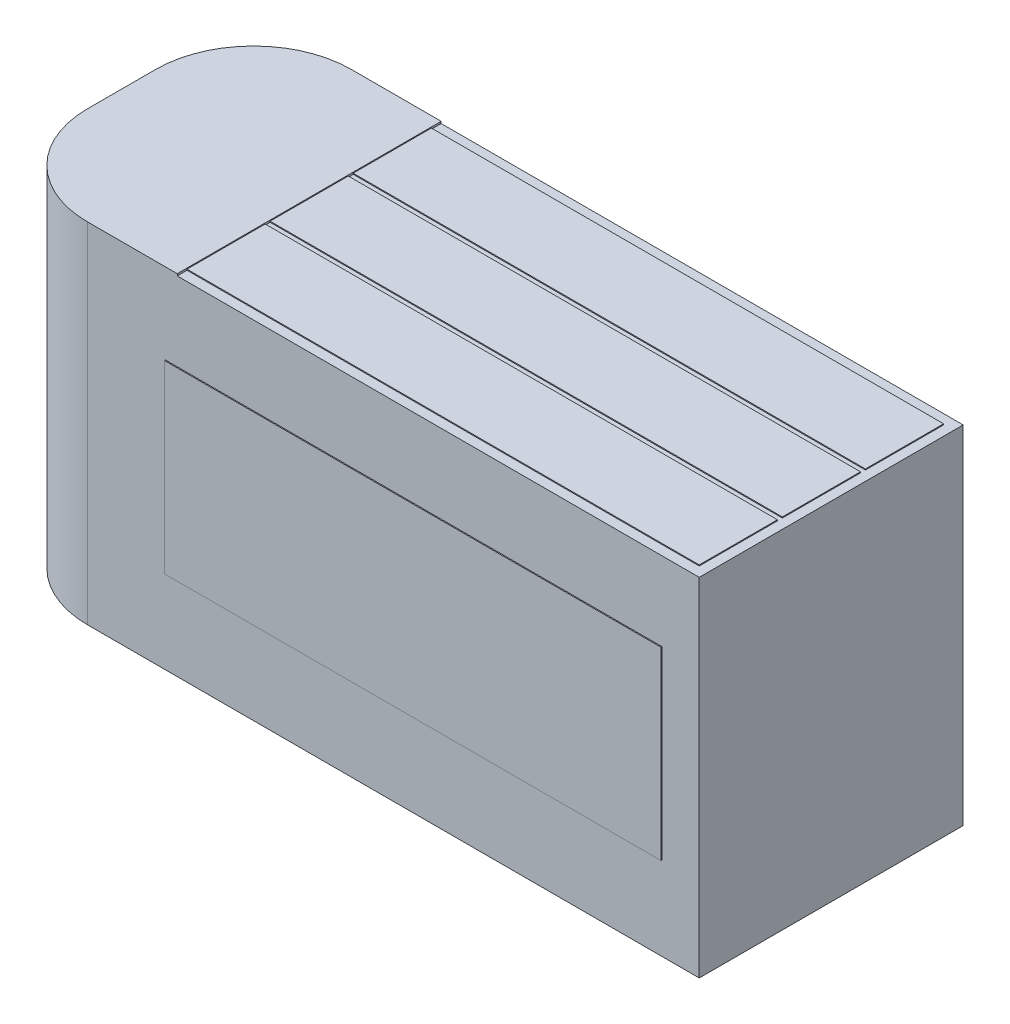
ISO-10303-21;
HEADER;
FILE_DESCRIPTION(('STEP AP214'),'2;1');
FILE_NAME('part.step','',(''),(''),'','','');
FILE_SCHEMA(('AUTOMOTIVE_DESIGN { 1 0 10303 214 1 1 1 1 }'));
ENDSEC;
DATA;
#1=APPLICATION_CONTEXT('core data for automotive mechanical design processes');
#2=APPLICATION_PROTOCOL_DEFINITION('international standard','automotive_design',2000,#1);
#3=PRODUCT_CONTEXT('',#1,'mechanical');
#4=PRODUCT('Part','Part','',(#3));
#5=PRODUCT_RELATED_PRODUCT_CATEGORY('part','',(#4));
#6=PRODUCT_DEFINITION_FORMATION('','',#4);
#7=PRODUCT_DEFINITION_CONTEXT('part definition',#1,'design');
#8=PRODUCT_DEFINITION('design','',#6,#7);
#9=PRODUCT_DEFINITION_SHAPE('','',#8);
#10=(LENGTH_UNIT() NAMED_UNIT(*) SI_UNIT(.MILLI.,.METRE.));
#11=(NAMED_UNIT(*) PLANE_ANGLE_UNIT() SI_UNIT($,.RADIAN.));
#12=(NAMED_UNIT(*) SI_UNIT($,.STERADIAN.) SOLID_ANGLE_UNIT());
#13=UNCERTAINTY_MEASURE_WITH_UNIT(LENGTH_MEASURE(1.E-05),#10,'distance_accuracy_value','');
#14=(GEOMETRIC_REPRESENTATION_CONTEXT(3) GLOBAL_UNCERTAINTY_ASSIGNED_CONTEXT((#13)) GLOBAL_UNIT_ASSIGNED_CONTEXT((#10,
#11,#12)) REPRESENTATION_CONTEXT('',''));
#15=CARTESIAN_POINT('',(0.,0.,0.));
#16=DIRECTION('',(0.,0.,1.));
#17=DIRECTION('',(1.,0.,0.));
#18=AXIS2_PLACEMENT_3D('',#15,#16,#17);
#19=CARTESIAN_POINT('',(0.,0.,0.));
#20=DIRECTION('',(0.,0.,-1.));
#21=DIRECTION('',(-1.,0.,0.));
#22=AXIS2_PLACEMENT_3D('',#19,#20,#21);
#23=PLANE('',#22);
#24=DIRECTION('',(1.,0.,0.));
#25=VECTOR('',#24,1.);
#26=CARTESIAN_POINT('',(-36.3,-17.75,0.));
#27=LINE('',#26,#25);
#28=CARTESIAN_POINT('',(-26.3,-17.75,0.));
#29=VERTEX_POINT('',#28);
#30=CARTESIAN_POINT('',(36.3,-17.75,0.));
#31=VERTEX_POINT('',#30);
#32=EDGE_CURVE('E470',#29,#31,#27,.T.);
#33=ORIENTED_EDGE('',*,*,#32,.F.);
#34=DIRECTION('',(0.,-1.,0.));
#35=VECTOR('',#34,1.);
#36=CARTESIAN_POINT('',(-26.3,17.75,0.));
#37=LINE('',#36,#35);
#38=CARTESIAN_POINT('',(-26.3,17.95,0.));
#39=VERTEX_POINT('',#38);
#40=EDGE_CURVE('E50',#29,#39,#37,.F.);
#41=ORIENTED_EDGE('',*,*,#40,.T.);
#42=DIRECTION('',(-1.,0.,0.));
#43=VECTOR('',#42,1.);
#44=CARTESIAN_POINT('',(-26.3,17.95,0.));
#45=LINE('',#44,#43);
#46=CARTESIAN_POINT('',(-17.1,17.95,0.));
#47=VERTEX_POINT('',#46);
#48=EDGE_CURVE('E269',#47,#39,#45,.T.);
#49=ORIENTED_EDGE('',*,*,#48,.F.);
#50=DIRECTION('',(0.,-1.,0.));
#51=VECTOR('',#50,1.);
#52=CARTESIAN_POINT('',(-17.1,17.95,0.));
#53=LINE('',#52,#51);
#54=CARTESIAN_POINT('',(-17.1,17.75,0.));
#55=VERTEX_POINT('',#54);
#56=EDGE_CURVE('E293',#47,#55,#53,.T.);
#57=ORIENTED_EDGE('',*,*,#56,.T.);
#58=DIRECTION('',(-1.,0.,0.));
#59=VECTOR('',#58,1.);
#60=CARTESIAN_POINT('',(-36.3,17.75,0.));
#61=LINE('',#60,#59);
#62=CARTESIAN_POINT('',(36.3,17.75,0.));
#63=VERTEX_POINT('',#62);
#64=EDGE_CURVE('E481',#63,#55,#61,.T.);
#65=ORIENTED_EDGE('',*,*,#64,.F.);
#66=DIRECTION('',(0.,1.,0.));
#67=VECTOR('',#66,1.);
#68=CARTESIAN_POINT('',(36.3,-17.75,0.));
#69=LINE('',#68,#67);
#70=EDGE_CURVE('E464',#31,#63,#69,.T.);
#71=ORIENTED_EDGE('',*,*,#70,.F.);
#72=EDGE_LOOP('',(#33,#41,#49,#57,#65,#71));
#73=FACE_BOUND('',#72,.T.);
#74=DIRECTION('',(-1.,0.,0.));
#75=VECTOR('',#74,1.);
#76=CARTESIAN_POINT('',(33.2747280856501,-8.4,0.));
#77=LINE('',#76,#75);
#78=CARTESIAN_POINT('',(33.2747280856501,-8.4,0.));
#79=VERTEX_POINT('',#78);
#80=CARTESIAN_POINT('',(-20.2252719143499,-8.4,0.));
#81=VERTEX_POINT('',#80);
#82=EDGE_CURVE('E908',#79,#81,#77,.T.);
#83=ORIENTED_EDGE('',*,*,#82,.F.);
#84=DIRECTION('',(0.,-1.,0.));
#85=VECTOR('',#84,1.);
#86=CARTESIAN_POINT('',(33.2747280856501,11.3,0.));
#87=LINE('',#86,#85);
#88=CARTESIAN_POINT('',(33.2747280856501,11.3,0.));
#89=VERTEX_POINT('',#88);
#90=EDGE_CURVE('E252',#89,#79,#87,.T.);
#91=ORIENTED_EDGE('',*,*,#90,.F.);
#92=DIRECTION('',(1.,0.,0.));
#93=VECTOR('',#92,1.);
#94=CARTESIAN_POINT('',(33.2747280856501,11.3,0.));
#95=LINE('',#94,#93);
#96=CARTESIAN_POINT('',(-20.2252719143499,11.3,0.));
#97=VERTEX_POINT('',#96);
#98=EDGE_CURVE('E248',#97,#89,#95,.T.);
#99=ORIENTED_EDGE('',*,*,#98,.F.);
#100=DIRECTION('',(0.,1.,0.));
#101=VECTOR('',#100,1.);
#102=CARTESIAN_POINT('',(-20.2252719143499,11.3,0.));
#103=LINE('',#102,#101);
#104=EDGE_CURVE('E904',#81,#97,#103,.T.);
#105=ORIENTED_EDGE('',*,*,#104,.F.);
#106=EDGE_LOOP('',(#83,#91,#99,#105));
#107=FACE_BOUND('',#106,.T.);
#108=ADVANCED_FACE('F41',(#73,#107),#23,.T.);
#109=CARTESIAN_POINT('',(-36.3,17.75,27.));
#110=DIRECTION('',(0.,-1.,0.));
#111=DIRECTION('',(0.,0.,-1.));
#112=AXIS2_PLACEMENT_3D('',#109,#110,#111);
#113=PLANE('',#112);
#114=DIRECTION('',(0.,0.,-1.));
#115=VECTOR('',#114,1.);
#116=CARTESIAN_POINT('',(-17.1,17.75,0.));
#117=LINE('',#116,#115);
#118=CARTESIAN_POINT('',(-17.1,17.75,27.));
#119=VERTEX_POINT('',#118);
#120=CARTESIAN_POINT('',(-17.1,17.75,26.));
#121=VERTEX_POINT('',#120);
#122=EDGE_CURVE('E261',#119,#121,#117,.T.);
#123=ORIENTED_EDGE('',*,*,#122,.F.);
#124=DIRECTION('',(-1.,0.,0.));
#125=VECTOR('',#124,1.);
#126=CARTESIAN_POINT('',(-36.3,17.75,27.));
#127=LINE('',#126,#125);
#128=CARTESIAN_POINT('',(36.3,17.75,27.));
#129=VERTEX_POINT('',#128);
#130=EDGE_CURVE('E469',#129,#119,#127,.T.);
#131=ORIENTED_EDGE('',*,*,#130,.F.);
#132=DIRECTION('',(0.,0.,-1.));
#133=VECTOR('',#132,1.);
#134=CARTESIAN_POINT('',(36.3,17.75,27.));
#135=LINE('',#134,#133);
#136=EDGE_CURVE('E494',#129,#63,#135,.T.);
#137=ORIENTED_EDGE('',*,*,#136,.T.);
#138=ORIENTED_EDGE('',*,*,#64,.T.);
#139=CARTESIAN_POINT('',(-17.1,17.75,0.999999999999997));
#140=VERTEX_POINT('',#139);
#141=EDGE_CURVE('E255',#140,#55,#117,.T.);
#142=ORIENTED_EDGE('',*,*,#141,.F.);
#143=DIRECTION('',(-1.,0.,0.));
#144=VECTOR('',#143,1.);
#145=CARTESIAN_POINT('',(35.3,17.75,0.999999999999997));
#146=LINE('',#145,#144);
#147=CARTESIAN_POINT('',(35.3,17.75,0.999999999999997));
#148=VERTEX_POINT('',#147);
#149=EDGE_CURVE('E443',#148,#140,#146,.T.);
#150=ORIENTED_EDGE('',*,*,#149,.F.);
#151=DIRECTION('',(0.,0.,-1.));
#152=VECTOR('',#151,1.);
#153=CARTESIAN_POINT('',(35.3,17.75,0.999999999999997));
#154=LINE('',#153,#152);
#155=CARTESIAN_POINT('',(35.3,17.75,9.));
#156=VERTEX_POINT('',#155);
#157=EDGE_CURVE('E422',#156,#148,#154,.T.);
#158=ORIENTED_EDGE('',*,*,#157,.F.);
#159=DIRECTION('',(1.,0.,0.));
#160=VECTOR('',#159,1.);
#161=CARTESIAN_POINT('',(35.3,17.75,9.));
#162=LINE('',#161,#160);
#163=CARTESIAN_POINT('',(-17.1,17.75,9.00000000000001));
#164=VERTEX_POINT('',#163);
#165=EDGE_CURVE('E428',#164,#156,#162,.T.);
#166=ORIENTED_EDGE('',*,*,#165,.F.);
#167=CARTESIAN_POINT('',(-17.1,17.75,9.5));
#168=VERTEX_POINT('',#167);
#169=EDGE_CURVE('E259',#168,#164,#117,.T.);
#170=ORIENTED_EDGE('',*,*,#169,.F.);
#171=DIRECTION('',(-1.,0.,0.));
#172=VECTOR('',#171,1.);
#173=CARTESIAN_POINT('',(35.3,17.75,9.5));
#174=LINE('',#173,#172);
#175=CARTESIAN_POINT('',(35.3,17.75,9.5));
#176=VERTEX_POINT('',#175);
#177=EDGE_CURVE('E401',#176,#168,#174,.T.);
#178=ORIENTED_EDGE('',*,*,#177,.F.);
#179=DIRECTION('',(0.,0.,-1.));
#180=VECTOR('',#179,1.);
#181=CARTESIAN_POINT('',(35.3,17.75,9.5));
#182=LINE('',#181,#180);
#183=CARTESIAN_POINT('',(35.3,17.75,17.5));
#184=VERTEX_POINT('',#183);
#185=EDGE_CURVE('E380',#184,#176,#182,.T.);
#186=ORIENTED_EDGE('',*,*,#185,.F.);
#187=DIRECTION('',(1.,0.,0.));
#188=VECTOR('',#187,1.);
#189=CARTESIAN_POINT('',(35.3,17.75,17.5));
#190=LINE('',#189,#188);
#191=CARTESIAN_POINT('',(-17.1,17.75,17.5));
#192=VERTEX_POINT('',#191);
#193=EDGE_CURVE('E386',#192,#184,#190,.T.);
#194=ORIENTED_EDGE('',*,*,#193,.F.);
#195=CARTESIAN_POINT('',(-17.1,17.75,18.));
#196=VERTEX_POINT('',#195);
#197=EDGE_CURVE('E290',#196,#192,#117,.T.);
#198=ORIENTED_EDGE('',*,*,#197,.F.);
#199=DIRECTION('',(-1.,0.,0.));
#200=VECTOR('',#199,1.);
#201=CARTESIAN_POINT('',(-17.1,17.75,18.));
#202=LINE('',#201,#200);
#203=CARTESIAN_POINT('',(35.3,17.75,18.));
#204=VERTEX_POINT('',#203);
#205=EDGE_CURVE('E345',#204,#196,#202,.T.);
#206=ORIENTED_EDGE('',*,*,#205,.F.);
#207=DIRECTION('',(0.,0.,-1.));
#208=VECTOR('',#207,1.);
#209=CARTESIAN_POINT('',(35.3,17.75,18.));
#210=LINE('',#209,#208);
#211=CARTESIAN_POINT('',(35.3,17.75,26.));
#212=VERTEX_POINT('',#211);
#213=EDGE_CURVE('E359',#212,#204,#210,.T.);
#214=ORIENTED_EDGE('',*,*,#213,.F.);
#215=DIRECTION('',(1.,0.,0.));
#216=VECTOR('',#215,1.);
#217=CARTESIAN_POINT('',(-17.1,17.75,26.));
#218=LINE('',#217,#216);
#219=EDGE_CURVE('E339',#121,#212,#218,.T.);
#220=ORIENTED_EDGE('',*,*,#219,.F.);
#221=EDGE_LOOP('',(#123,#131,#137,#138,#142,#150,#158,#166,#170,#178,#186,#194,#198,#206,#214,#220));
#222=FACE_BOUND('',#221,.T.);
#223=ADVANCED_FACE('F543',(#222),#113,.F.);
#224=CARTESIAN_POINT('',(0.,0.,27.));
#225=DIRECTION('',(0.,0.,-1.));
#226=DIRECTION('',(-1.,0.,0.));
#227=AXIS2_PLACEMENT_3D('',#224,#225,#226);
#228=PLANE('',#227);
#229=ORIENTED_EDGE('',*,*,#130,.T.);
#230=DIRECTION('',(0.,-1.,0.));
#231=VECTOR('',#230,1.);
#232=CARTESIAN_POINT('',(-17.1,17.95,27.));
#233=LINE('',#232,#231);
#234=CARTESIAN_POINT('',(-17.1,17.95,27.));
#235=VERTEX_POINT('',#234);
#236=EDGE_CURVE('E287',#235,#119,#233,.T.);
#237=ORIENTED_EDGE('',*,*,#236,.F.);
#238=DIRECTION('',(1.,0.,0.));
#239=VECTOR('',#238,1.);
#240=CARTESIAN_POINT('',(-17.1,17.95,27.));
#241=LINE('',#240,#239);
#242=CARTESIAN_POINT('',(-26.3,17.95,27.));
#243=VERTEX_POINT('',#242);
#244=EDGE_CURVE('E285',#243,#235,#241,.T.);
#245=ORIENTED_EDGE('',*,*,#244,.F.);
#246=DIRECTION('',(0.,-1.,0.));
#247=VECTOR('',#246,1.);
#248=CARTESIAN_POINT('',(-26.3,0.,27.));
#249=LINE('',#248,#247);
#250=CARTESIAN_POINT('',(-26.3,-17.75,27.));
#251=VERTEX_POINT('',#250);
#252=EDGE_CURVE('E11',#243,#251,#249,.T.);
#253=ORIENTED_EDGE('',*,*,#252,.T.);
#254=DIRECTION('',(1.,0.,0.));
#255=VECTOR('',#254,1.);
#256=CARTESIAN_POINT('',(-36.3,-17.75,27.));
#257=LINE('',#256,#255);
#258=CARTESIAN_POINT('',(36.3,-17.75,27.));
#259=VERTEX_POINT('',#258);
#260=EDGE_CURVE('E474',#251,#259,#257,.T.);
#261=ORIENTED_EDGE('',*,*,#260,.T.);
#262=DIRECTION('',(0.,1.,0.));
#263=VECTOR('',#262,1.);
#264=CARTESIAN_POINT('',(36.3,-17.75,27.));
#265=LINE('',#264,#263);
#266=EDGE_CURVE('E465',#259,#129,#265,.T.);
#267=ORIENTED_EDGE('',*,*,#266,.T.);
#268=EDGE_LOOP('',(#229,#237,#245,#253,#261,#267));
#269=FACE_BOUND('',#268,.T.);
#270=DIRECTION('',(0.,-1.,0.));
#271=VECTOR('',#270,1.);
#272=CARTESIAN_POINT('',(-18.3,9.7,27.));
#273=LINE('',#272,#271);
#274=CARTESIAN_POINT('',(-18.3,9.7,27.));
#275=VERTEX_POINT('',#274);
#276=CARTESIAN_POINT('',(-18.3,-9.2,27.));
#277=VERTEX_POINT('',#276);
#278=EDGE_CURVE('E297',#275,#277,#273,.T.);
#279=ORIENTED_EDGE('',*,*,#278,.F.);
#280=DIRECTION('',(-1.,0.,0.));
#281=VECTOR('',#280,1.);
#282=CARTESIAN_POINT('',(-18.3,9.7,27.));
#283=LINE('',#282,#281);
#284=CARTESIAN_POINT('',(32.5,9.7,27.));
#285=VERTEX_POINT('',#284);
#286=EDGE_CURVE('E303',#285,#275,#283,.T.);
#287=ORIENTED_EDGE('',*,*,#286,.F.);
#288=DIRECTION('',(0.,1.,0.));
#289=VECTOR('',#288,1.);
#290=CARTESIAN_POINT('',(32.5,9.7,27.));
#291=LINE('',#290,#289);
#292=CARTESIAN_POINT('',(32.5,-9.2,27.));
#293=VERTEX_POINT('',#292);
#294=EDGE_CURVE('E318',#293,#285,#291,.T.);
#295=ORIENTED_EDGE('',*,*,#294,.F.);
#296=DIRECTION('',(1.,0.,0.));
#297=VECTOR('',#296,1.);
#298=CARTESIAN_POINT('',(-18.3,-9.2,27.));
#299=LINE('',#298,#297);
#300=EDGE_CURVE('E65',#277,#293,#299,.T.);
#301=ORIENTED_EDGE('',*,*,#300,.F.);
#302=EDGE_LOOP('',(#279,#287,#295,#301));
#303=FACE_BOUND('',#302,.T.);
#304=ADVANCED_FACE('F536',(#269,#303),#228,.F.);
#305=CARTESIAN_POINT('',(36.3,-17.75,27.));
#306=DIRECTION('',(-1.,0.,0.));
#307=DIRECTION('',(0.,0.,1.));
#308=AXIS2_PLACEMENT_3D('',#305,#306,#307);
#309=PLANE('',#308);
#310=ORIENTED_EDGE('',*,*,#70,.T.);
#311=ORIENTED_EDGE('',*,*,#136,.F.);
#312=ORIENTED_EDGE('',*,*,#266,.F.);
#313=DIRECTION('',(0.,0.,-1.));
#314=VECTOR('',#313,1.);
#315=CARTESIAN_POINT('',(36.3,-17.75,27.));
#316=LINE('',#315,#314);
#317=EDGE_CURVE('E477',#259,#31,#316,.T.);
#318=ORIENTED_EDGE('',*,*,#317,.T.);
#319=EDGE_LOOP('',(#310,#311,#312,#318));
#320=FACE_BOUND('',#319,.T.);
#321=ADVANCED_FACE('F547',(#320),#309,.F.);
#322=CARTESIAN_POINT('',(-36.3,-17.75,27.));
#323=DIRECTION('',(1.,0.,0.));
#324=DIRECTION('',(0.,0.,-1.));
#325=AXIS2_PLACEMENT_3D('',#322,#323,#324);
#326=PLANE('',#325);
#327=DIRECTION('',(0.,-1.,0.));
#328=VECTOR('',#327,1.);
#329=CARTESIAN_POINT('',(-36.3,-17.75,17.));
#330=LINE('',#329,#328);
#331=CARTESIAN_POINT('',(-36.3,-17.75,17.));
#332=VERTEX_POINT('',#331);
#333=CARTESIAN_POINT('',(-36.3,17.95,17.));
#334=VERTEX_POINT('',#333);
#335=EDGE_CURVE('E498',#332,#334,#330,.F.);
#336=ORIENTED_EDGE('',*,*,#335,.T.);
#337=DIRECTION('',(0.,0.,1.));
#338=VECTOR('',#337,1.);
#339=CARTESIAN_POINT('',(-36.3,17.95,10.));
#340=LINE('',#339,#338);
#341=CARTESIAN_POINT('',(-36.3,17.95,9.99999999999999));
#342=VERTEX_POINT('',#341);
#343=EDGE_CURVE('E277',#342,#334,#340,.T.);
#344=ORIENTED_EDGE('',*,*,#343,.F.);
#345=DIRECTION('',(0.,-1.,0.));
#346=VECTOR('',#345,1.);
#347=CARTESIAN_POINT('',(-36.3,-17.75,10.));
#348=LINE('',#347,#346);
#349=CARTESIAN_POINT('',(-36.3,-17.75,10.));
#350=VERTEX_POINT('',#349);
#351=EDGE_CURVE('E501',#342,#350,#348,.T.);
#352=ORIENTED_EDGE('',*,*,#351,.T.);
#353=DIRECTION('',(0.,0.,-1.));
#354=VECTOR('',#353,1.);
#355=CARTESIAN_POINT('',(-36.3,-17.75,27.));
#356=LINE('',#355,#354);
#357=EDGE_CURVE('E490',#332,#350,#356,.T.);
#358=ORIENTED_EDGE('',*,*,#357,.F.);
#359=EDGE_LOOP('',(#336,#344,#352,#358));
#360=FACE_BOUND('',#359,.T.);
#361=ADVANCED_FACE('F526',(#360),#326,.F.);
#362=CARTESIAN_POINT('',(-36.3,-17.75,27.));
#363=DIRECTION('',(0.,1.,0.));
#364=DIRECTION('',(0.,0.,1.));
#365=AXIS2_PLACEMENT_3D('',#362,#363,#364);
#366=PLANE('',#365);
#367=ORIENTED_EDGE('',*,*,#357,.T.);
#368=CARTESIAN_POINT('',(-26.3,-17.75,10.));
#369=DIRECTION('',(0.,1.,0.));
#370=DIRECTION('',(0.,0.,1.));
#371=AXIS2_PLACEMENT_3D('',#368,#369,#370);
#372=CIRCLE('',#371,10.);
#373=EDGE_CURVE('E508',#350,#29,#372,.F.);
#374=ORIENTED_EDGE('',*,*,#373,.T.);
#375=ORIENTED_EDGE('',*,*,#32,.T.);
#376=ORIENTED_EDGE('',*,*,#317,.F.);
#377=ORIENTED_EDGE('',*,*,#260,.F.);
#378=CARTESIAN_POINT('',(-26.3,-17.75,17.));
#379=DIRECTION('',(0.,1.,0.));
#380=DIRECTION('',(0.,0.,1.));
#381=AXIS2_PLACEMENT_3D('',#378,#379,#380);
#382=CIRCLE('',#381,10.);
#383=EDGE_CURVE('E505',#251,#332,#382,.F.);
#384=ORIENTED_EDGE('',*,*,#383,.T.);
#385=EDGE_LOOP('',(#367,#374,#375,#376,#377,#384));
#386=FACE_BOUND('',#385,.T.);
#387=ADVANCED_FACE('F529',(#386),#366,.F.);
#388=CARTESIAN_POINT('',(-26.3,-17.75,10.));
#389=DIRECTION('',(0.,1.,0.));
#390=DIRECTION('',(0.,0.,1.));
#391=AXIS2_PLACEMENT_3D('',#388,#389,#390);
#392=CYLINDRICAL_SURFACE('',#391,10.);
#393=ORIENTED_EDGE('',*,*,#351,.F.);
#394=CARTESIAN_POINT('',(-26.3,17.95,10.));
#395=DIRECTION('',(0.,1.,0.));
#396=DIRECTION('',(0.,0.,1.));
#397=AXIS2_PLACEMENT_3D('',#394,#395,#396);
#398=CIRCLE('',#397,10.);
#399=EDGE_CURVE('E273',#39,#342,#398,.T.);
#400=ORIENTED_EDGE('',*,*,#399,.F.);
#401=ORIENTED_EDGE('',*,*,#40,.F.);
#402=ORIENTED_EDGE('',*,*,#373,.F.);
#403=EDGE_LOOP('',(#393,#400,#401,#402));
#404=FACE_BOUND('',#403,.T.);
#405=ADVANCED_FACE('F523',(#404),#392,.T.);
#406=CARTESIAN_POINT('',(-26.3,0.,17.));
#407=DIRECTION('',(0.,-1.,0.));
#408=DIRECTION('',(0.,0.,-1.));
#409=AXIS2_PLACEMENT_3D('',#406,#407,#408);
#410=CYLINDRICAL_SURFACE('',#409,10.);
#411=ORIENTED_EDGE('',*,*,#252,.F.);
#412=CARTESIAN_POINT('',(-26.2999999999999,17.95,16.9999999999999));
#413=DIRECTION('',(0.,1.,0.));
#414=DIRECTION('',(0.,0.,-1.));
#415=AXIS2_PLACEMENT_3D('',#412,#413,#414);
#416=CIRCLE('',#415,10.0000000000001);
#417=EDGE_CURVE('E281',#334,#243,#416,.T.);
#418=ORIENTED_EDGE('',*,*,#417,.F.);
#419=ORIENTED_EDGE('',*,*,#335,.F.);
#420=ORIENTED_EDGE('',*,*,#383,.F.);
#421=EDGE_LOOP('',(#411,#418,#419,#420));
#422=FACE_BOUND('',#421,.T.);
#423=ADVANCED_FACE('F43',(#422),#410,.T.);
#424=CARTESIAN_POINT('',(35.3,17.85,0.999999999999997));
#425=DIRECTION('',(-1.,0.,0.));
#426=DIRECTION('',(0.,0.,1.));
#427=AXIS2_PLACEMENT_3D('',#424,#425,#426);
#428=PLANE('',#427);
#429=ORIENTED_EDGE('',*,*,#157,.T.);
#430=DIRECTION('',(0.,-1.,0.));
#431=VECTOR('',#430,1.);
#432=CARTESIAN_POINT('',(35.3,17.85,0.999999999999997));
#433=LINE('',#432,#431);
#434=CARTESIAN_POINT('',(35.3,17.85,0.999999999999997));
#435=VERTEX_POINT('',#434);
#436=EDGE_CURVE('E460',#435,#148,#433,.T.);
#437=ORIENTED_EDGE('',*,*,#436,.F.);
#438=DIRECTION('',(0.,0.,-1.));
#439=VECTOR('',#438,1.);
#440=CARTESIAN_POINT('',(35.3,17.85,0.999999999999997));
#441=LINE('',#440,#439);
#442=CARTESIAN_POINT('',(35.3,17.85,9.));
#443=VERTEX_POINT('',#442);
#444=EDGE_CURVE('E423',#443,#435,#441,.T.);
#445=ORIENTED_EDGE('',*,*,#444,.F.);
#446=DIRECTION('',(0.,-1.,0.));
#447=VECTOR('',#446,1.);
#448=CARTESIAN_POINT('',(35.3,17.85,9.));
#449=LINE('',#448,#447);
#450=EDGE_CURVE('E439',#443,#156,#449,.T.);
#451=ORIENTED_EDGE('',*,*,#450,.T.);
#452=EDGE_LOOP('',(#429,#437,#445,#451));
#453=FACE_BOUND('',#452,.T.);
#454=ADVANCED_FACE('F572',(#453),#428,.F.);
#455=CARTESIAN_POINT('',(35.3,17.85,0.999999999999997));
#456=DIRECTION('',(0.,0.,1.));
#457=DIRECTION('',(1.,0.,0.));
#458=AXIS2_PLACEMENT_3D('',#455,#456,#457);
#459=PLANE('',#458);
#460=ORIENTED_EDGE('',*,*,#149,.T.);
#461=DIRECTION('',(0.,-1.,0.));
#462=VECTOR('',#461,1.);
#463=CARTESIAN_POINT('',(-17.1,17.85,0.999999999999997));
#464=LINE('',#463,#462);
#465=CARTESIAN_POINT('',(-17.1,17.85,0.999999999999997));
#466=VERTEX_POINT('',#465);
#467=EDGE_CURVE('E457',#466,#140,#464,.T.);
#468=ORIENTED_EDGE('',*,*,#467,.F.);
#469=DIRECTION('',(-1.,0.,0.));
#470=VECTOR('',#469,1.);
#471=CARTESIAN_POINT('',(35.3,17.85,0.999999999999997));
#472=LINE('',#471,#470);
#473=EDGE_CURVE('E427',#435,#466,#472,.T.);
#474=ORIENTED_EDGE('',*,*,#473,.F.);
#475=ORIENTED_EDGE('',*,*,#436,.T.);
#476=EDGE_LOOP('',(#460,#468,#474,#475));
#477=FACE_BOUND('',#476,.T.);
#478=ADVANCED_FACE('F576',(#477),#459,.F.);
#479=CARTESIAN_POINT('',(35.3,17.85,9.));
#480=DIRECTION('',(0.,0.,-1.));
#481=DIRECTION('',(-1.,0.,0.));
#482=AXIS2_PLACEMENT_3D('',#479,#480,#481);
#483=PLANE('',#482);
#484=ORIENTED_EDGE('',*,*,#165,.T.);
#485=ORIENTED_EDGE('',*,*,#450,.F.);
#486=DIRECTION('',(1.,0.,0.));
#487=VECTOR('',#486,1.);
#488=CARTESIAN_POINT('',(35.3,17.85,9.));
#489=LINE('',#488,#487);
#490=CARTESIAN_POINT('',(-17.1,17.85,9.00000000000001));
#491=VERTEX_POINT('',#490);
#492=EDGE_CURVE('E436',#491,#443,#489,.T.);
#493=ORIENTED_EDGE('',*,*,#492,.F.);
#494=DIRECTION('',(0.,-1.,0.));
#495=VECTOR('',#494,1.);
#496=CARTESIAN_POINT('',(-17.1,17.85,9.00000000000001));
#497=LINE('',#496,#495);
#498=EDGE_CURVE('E453',#491,#164,#497,.T.);
#499=ORIENTED_EDGE('',*,*,#498,.T.);
#500=EDGE_LOOP('',(#484,#485,#493,#499));
#501=FACE_BOUND('',#500,.T.);
#502=ADVANCED_FACE('F581',(#501),#483,.F.);
#503=CARTESIAN_POINT('',(0.,17.85,0.));
#504=DIRECTION('',(0.,-1.,0.));
#505=DIRECTION('',(0.,0.,-1.));
#506=AXIS2_PLACEMENT_3D('',#503,#504,#505);
#507=PLANE('',#506);
#508=ORIENTED_EDGE('',*,*,#444,.T.);
#509=ORIENTED_EDGE('',*,*,#473,.T.);
#510=DIRECTION('',(0.,0.,1.));
#511=VECTOR('',#510,1.);
#512=CARTESIAN_POINT('',(-17.1,17.85,0.999999999999997));
#513=LINE('',#512,#511);
#514=EDGE_CURVE('E432',#466,#491,#513,.T.);
#515=ORIENTED_EDGE('',*,*,#514,.T.);
#516=ORIENTED_EDGE('',*,*,#492,.T.);
#517=EDGE_LOOP('',(#508,#509,#515,#516));
#518=FACE_BOUND('',#517,.T.);
#519=ADVANCED_FACE('F587',(#518),#507,.F.);
#520=CARTESIAN_POINT('',(35.3,17.85,9.5));
#521=DIRECTION('',(-1.,0.,0.));
#522=DIRECTION('',(0.,0.,1.));
#523=AXIS2_PLACEMENT_3D('',#520,#521,#522);
#524=PLANE('',#523);
#525=ORIENTED_EDGE('',*,*,#185,.T.);
#526=DIRECTION('',(0.,-1.,0.));
#527=VECTOR('',#526,1.);
#528=CARTESIAN_POINT('',(35.3,17.85,9.5));
#529=LINE('',#528,#527);
#530=CARTESIAN_POINT('',(35.3,17.85,9.5));
#531=VERTEX_POINT('',#530);
#532=EDGE_CURVE('E418',#531,#176,#529,.T.);
#533=ORIENTED_EDGE('',*,*,#532,.F.);
#534=DIRECTION('',(0.,0.,-1.));
#535=VECTOR('',#534,1.);
#536=CARTESIAN_POINT('',(35.3,17.85,9.5));
#537=LINE('',#536,#535);
#538=CARTESIAN_POINT('',(35.3,17.85,17.5));
#539=VERTEX_POINT('',#538);
#540=EDGE_CURVE('E381',#539,#531,#537,.T.);
#541=ORIENTED_EDGE('',*,*,#540,.F.);
#542=DIRECTION('',(0.,-1.,0.));
#543=VECTOR('',#542,1.);
#544=CARTESIAN_POINT('',(35.3,17.85,17.5));
#545=LINE('',#544,#543);
#546=EDGE_CURVE('E397',#539,#184,#545,.T.);
#547=ORIENTED_EDGE('',*,*,#546,.T.);
#548=EDGE_LOOP('',(#525,#533,#541,#547));
#549=FACE_BOUND('',#548,.T.);
#550=ADVANCED_FACE('F591',(#549),#524,.F.);
#551=CARTESIAN_POINT('',(35.3,17.85,9.5));
#552=DIRECTION('',(0.,0.,1.));
#553=DIRECTION('',(1.,0.,0.));
#554=AXIS2_PLACEMENT_3D('',#551,#552,#553);
#555=PLANE('',#554);
#556=ORIENTED_EDGE('',*,*,#177,.T.);
#557=DIRECTION('',(0.,-1.,0.));
#558=VECTOR('',#557,1.);
#559=CARTESIAN_POINT('',(-17.1,17.85,9.5));
#560=LINE('',#559,#558);
#561=CARTESIAN_POINT('',(-17.1,17.85,9.5));
#562=VERTEX_POINT('',#561);
#563=EDGE_CURVE('E415',#562,#168,#560,.T.);
#564=ORIENTED_EDGE('',*,*,#563,.F.);
#565=DIRECTION('',(-1.,0.,0.));
#566=VECTOR('',#565,1.);
#567=CARTESIAN_POINT('',(35.3,17.85,9.5));
#568=LINE('',#567,#566);
#569=EDGE_CURVE('E385',#531,#562,#568,.T.);
#570=ORIENTED_EDGE('',*,*,#569,.F.);
#571=ORIENTED_EDGE('',*,*,#532,.T.);
#572=EDGE_LOOP('',(#556,#564,#570,#571));
#573=FACE_BOUND('',#572,.T.);
#574=ADVANCED_FACE('F595',(#573),#555,.F.);
#575=CARTESIAN_POINT('',(35.3,17.85,17.5));
#576=DIRECTION('',(0.,0.,-1.));
#577=DIRECTION('',(-1.,0.,0.));
#578=AXIS2_PLACEMENT_3D('',#575,#576,#577);
#579=PLANE('',#578);
#580=ORIENTED_EDGE('',*,*,#193,.T.);
#581=ORIENTED_EDGE('',*,*,#546,.F.);
#582=DIRECTION('',(1.,0.,0.));
#583=VECTOR('',#582,1.);
#584=CARTESIAN_POINT('',(35.3,17.85,17.5));
#585=LINE('',#584,#583);
#586=CARTESIAN_POINT('',(-17.1,17.85,17.5));
#587=VERTEX_POINT('',#586);
#588=EDGE_CURVE('E394',#587,#539,#585,.T.);
#589=ORIENTED_EDGE('',*,*,#588,.F.);
#590=DIRECTION('',(0.,-1.,0.));
#591=VECTOR('',#590,1.);
#592=CARTESIAN_POINT('',(-17.1,17.85,17.5));
#593=LINE('',#592,#591);
#594=EDGE_CURVE('E411',#587,#192,#593,.T.);
#595=ORIENTED_EDGE('',*,*,#594,.T.);
#596=EDGE_LOOP('',(#580,#581,#589,#595));
#597=FACE_BOUND('',#596,.T.);
#598=ADVANCED_FACE('F599',(#597),#579,.F.);
#599=CARTESIAN_POINT('',(0.,17.85,0.));
#600=DIRECTION('',(0.,-1.,0.));
#601=DIRECTION('',(0.,0.,-1.));
#602=AXIS2_PLACEMENT_3D('',#599,#600,#601);
#603=PLANE('',#602);
#604=ORIENTED_EDGE('',*,*,#540,.T.);
#605=ORIENTED_EDGE('',*,*,#569,.T.);
#606=DIRECTION('',(0.,0.,1.));
#607=VECTOR('',#606,1.);
#608=CARTESIAN_POINT('',(-17.1,17.85,9.5));
#609=LINE('',#608,#607);
#610=EDGE_CURVE('E390',#562,#587,#609,.T.);
#611=ORIENTED_EDGE('',*,*,#610,.T.);
#612=ORIENTED_EDGE('',*,*,#588,.T.);
#613=EDGE_LOOP('',(#604,#605,#611,#612));
#614=FACE_BOUND('',#613,.T.);
#615=ADVANCED_FACE('F603',(#614),#603,.F.);
#616=CARTESIAN_POINT('',(-17.1,17.85,26.));
#617=DIRECTION('',(0.,0.,-1.));
#618=DIRECTION('',(-1.,0.,0.));
#619=AXIS2_PLACEMENT_3D('',#616,#617,#618);
#620=PLANE('',#619);
#621=ORIENTED_EDGE('',*,*,#219,.T.);
#622=DIRECTION('',(0.,-1.,0.));
#623=VECTOR('',#622,1.);
#624=CARTESIAN_POINT('',(35.3,17.85,26.));
#625=LINE('',#624,#623);
#626=CARTESIAN_POINT('',(35.3,17.85,26.));
#627=VERTEX_POINT('',#626);
#628=EDGE_CURVE('E372',#627,#212,#625,.T.);
#629=ORIENTED_EDGE('',*,*,#628,.F.);
#630=DIRECTION('',(1.,0.,0.));
#631=VECTOR('',#630,1.);
#632=CARTESIAN_POINT('',(-17.1,17.85,26.));
#633=LINE('',#632,#631);
#634=CARTESIAN_POINT('',(-17.1,17.85,26.));
#635=VERTEX_POINT('',#634);
#636=EDGE_CURVE('E344',#635,#627,#633,.T.);
#637=ORIENTED_EDGE('',*,*,#636,.F.);
#638=DIRECTION('',(0.,-1.,0.));
#639=VECTOR('',#638,1.);
#640=CARTESIAN_POINT('',(-17.1,17.85,26.));
#641=LINE('',#640,#639);
#642=EDGE_CURVE('E376',#635,#121,#641,.T.);
#643=ORIENTED_EDGE('',*,*,#642,.T.);
#644=EDGE_LOOP('',(#621,#629,#637,#643));
#645=FACE_BOUND('',#644,.T.);
#646=ADVANCED_FACE('F607',(#645),#620,.F.);
#647=CARTESIAN_POINT('',(35.3,17.85,18.));
#648=DIRECTION('',(-1.,0.,0.));
#649=DIRECTION('',(0.,0.,1.));
#650=AXIS2_PLACEMENT_3D('',#647,#648,#649);
#651=PLANE('',#650);
#652=ORIENTED_EDGE('',*,*,#213,.T.);
#653=DIRECTION('',(0.,-1.,0.));
#654=VECTOR('',#653,1.);
#655=CARTESIAN_POINT('',(35.3,17.85,18.));
#656=LINE('',#655,#654);
#657=CARTESIAN_POINT('',(35.3,17.85,18.));
#658=VERTEX_POINT('',#657);
#659=EDGE_CURVE('E368',#658,#204,#656,.T.);
#660=ORIENTED_EDGE('',*,*,#659,.F.);
#661=DIRECTION('',(0.,0.,-1.));
#662=VECTOR('',#661,1.);
#663=CARTESIAN_POINT('',(35.3,17.85,18.));
#664=LINE('',#663,#662);
#665=EDGE_CURVE('E348',#627,#658,#664,.T.);
#666=ORIENTED_EDGE('',*,*,#665,.F.);
#667=ORIENTED_EDGE('',*,*,#628,.T.);
#668=EDGE_LOOP('',(#652,#660,#666,#667));
#669=FACE_BOUND('',#668,.T.);
#670=ADVANCED_FACE('F611',(#669),#651,.F.);
#671=CARTESIAN_POINT('',(-17.1,17.85,18.));
#672=DIRECTION('',(0.,0.,1.));
#673=DIRECTION('',(1.,0.,0.));
#674=AXIS2_PLACEMENT_3D('',#671,#672,#673);
#675=PLANE('',#674);
#676=ORIENTED_EDGE('',*,*,#205,.T.);
#677=DIRECTION('',(0.,-1.,0.));
#678=VECTOR('',#677,1.);
#679=CARTESIAN_POINT('',(-17.1,17.85,18.));
#680=LINE('',#679,#678);
#681=CARTESIAN_POINT('',(-17.1,17.85,18.));
#682=VERTEX_POINT('',#681);
#683=EDGE_CURVE('E355',#682,#196,#680,.T.);
#684=ORIENTED_EDGE('',*,*,#683,.F.);
#685=DIRECTION('',(-1.,0.,0.));
#686=VECTOR('',#685,1.);
#687=CARTESIAN_POINT('',(-17.1,17.85,18.));
#688=LINE('',#687,#686);
#689=EDGE_CURVE('E351',#658,#682,#688,.T.);
#690=ORIENTED_EDGE('',*,*,#689,.F.);
#691=ORIENTED_EDGE('',*,*,#659,.T.);
#692=EDGE_LOOP('',(#676,#684,#690,#691));
#693=FACE_BOUND('',#692,.T.);
#694=ADVANCED_FACE('F615',(#693),#675,.F.);
#695=CARTESIAN_POINT('',(0.,17.85,0.));
#696=DIRECTION('',(0.,1.,0.));
#697=DIRECTION('',(0.,0.,1.));
#698=AXIS2_PLACEMENT_3D('',#695,#696,#697);
#699=PLANE('',#698);
#700=DIRECTION('',(0.,0.,1.));
#701=VECTOR('',#700,1.);
#702=CARTESIAN_POINT('',(-17.1,17.85,18.));
#703=LINE('',#702,#701);
#704=EDGE_CURVE('E340',#682,#635,#703,.T.);
#705=ORIENTED_EDGE('',*,*,#704,.T.);
#706=ORIENTED_EDGE('',*,*,#636,.T.);
#707=ORIENTED_EDGE('',*,*,#665,.T.);
#708=ORIENTED_EDGE('',*,*,#689,.T.);
#709=EDGE_LOOP('',(#705,#706,#707,#708));
#710=FACE_BOUND('',#709,.T.);
#711=ADVANCED_FACE('F619',(#710),#699,.T.);
#712=CARTESIAN_POINT('',(-18.3,9.7,27.1));
#713=DIRECTION('',(1.,0.,0.));
#714=DIRECTION('',(0.,0.,-1.));
#715=AXIS2_PLACEMENT_3D('',#712,#713,#714);
#716=PLANE('',#715);
#717=ORIENTED_EDGE('',*,*,#278,.T.);
#718=DIRECTION('',(0.,0.,-1.));
#719=VECTOR('',#718,1.);
#720=CARTESIAN_POINT('',(-18.3,-9.2,27.1));
#721=LINE('',#720,#719);
#722=CARTESIAN_POINT('',(-18.3,-9.2,27.1));
#723=VERTEX_POINT('',#722);
#724=EDGE_CURVE('E336',#723,#277,#721,.T.);
#725=ORIENTED_EDGE('',*,*,#724,.F.);
#726=DIRECTION('',(0.,-1.,0.));
#727=VECTOR('',#726,1.);
#728=CARTESIAN_POINT('',(-18.3,9.7,27.1));
#729=LINE('',#728,#727);
#730=CARTESIAN_POINT('',(-18.3,9.7,27.1));
#731=VERTEX_POINT('',#730);
#732=EDGE_CURVE('E298',#731,#723,#729,.T.);
#733=ORIENTED_EDGE('',*,*,#732,.F.);
#734=DIRECTION('',(0.,0.,-1.));
#735=VECTOR('',#734,1.);
#736=CARTESIAN_POINT('',(-18.3,9.7,27.1));
#737=LINE('',#736,#735);
#738=EDGE_CURVE('E312',#731,#275,#737,.T.);
#739=ORIENTED_EDGE('',*,*,#738,.T.);
#740=EDGE_LOOP('',(#717,#725,#733,#739));
#741=FACE_BOUND('',#740,.T.);
#742=ADVANCED_FACE('F623',(#741),#716,.F.);
#743=CARTESIAN_POINT('',(-18.3,-9.2,27.1));
#744=DIRECTION('',(0.,1.,0.));
#745=DIRECTION('',(0.,0.,1.));
#746=AXIS2_PLACEMENT_3D('',#743,#744,#745);
#747=PLANE('',#746);
#748=ORIENTED_EDGE('',*,*,#300,.T.);
#749=DIRECTION('',(0.,0.,-1.));
#750=VECTOR('',#749,1.);
#751=CARTESIAN_POINT('',(32.5,-9.2,27.1));
#752=LINE('',#751,#750);
#753=CARTESIAN_POINT('',(32.5,-9.2,27.1));
#754=VERTEX_POINT('',#753);
#755=EDGE_CURVE('E332',#754,#293,#752,.T.);
#756=ORIENTED_EDGE('',*,*,#755,.F.);
#757=DIRECTION('',(1.,0.,0.));
#758=VECTOR('',#757,1.);
#759=CARTESIAN_POINT('',(-18.3,-9.2,27.1));
#760=LINE('',#759,#758);
#761=EDGE_CURVE('E302',#723,#754,#760,.T.);
#762=ORIENTED_EDGE('',*,*,#761,.F.);
#763=ORIENTED_EDGE('',*,*,#724,.T.);
#764=EDGE_LOOP('',(#748,#756,#762,#763));
#765=FACE_BOUND('',#764,.T.);
#766=ADVANCED_FACE('F627',(#765),#747,.F.);
#767=CARTESIAN_POINT('',(32.5,9.7,27.1));
#768=DIRECTION('',(-1.,0.,0.));
#769=DIRECTION('',(0.,0.,1.));
#770=AXIS2_PLACEMENT_3D('',#767,#768,#769);
#771=PLANE('',#770);
#772=ORIENTED_EDGE('',*,*,#294,.T.);
#773=DIRECTION('',(0.,0.,-1.));
#774=VECTOR('',#773,1.);
#775=CARTESIAN_POINT('',(32.5,9.7,27.1));
#776=LINE('',#775,#774);
#777=CARTESIAN_POINT('',(32.5,9.7,27.1));
#778=VERTEX_POINT('',#777);
#779=EDGE_CURVE('E328',#778,#285,#776,.T.);
#780=ORIENTED_EDGE('',*,*,#779,.F.);
#781=DIRECTION('',(0.,1.,0.));
#782=VECTOR('',#781,1.);
#783=CARTESIAN_POINT('',(32.5,9.7,27.1));
#784=LINE('',#783,#782);
#785=EDGE_CURVE('E306',#754,#778,#784,.T.);
#786=ORIENTED_EDGE('',*,*,#785,.F.);
#787=ORIENTED_EDGE('',*,*,#755,.T.);
#788=EDGE_LOOP('',(#772,#780,#786,#787));
#789=FACE_BOUND('',#788,.T.);
#790=ADVANCED_FACE('F631',(#789),#771,.F.);
#791=CARTESIAN_POINT('',(-18.3,9.7,27.1));
#792=DIRECTION('',(0.,-1.,0.));
#793=DIRECTION('',(0.,0.,-1.));
#794=AXIS2_PLACEMENT_3D('',#791,#792,#793);
#795=PLANE('',#794);
#796=ORIENTED_EDGE('',*,*,#286,.T.);
#797=ORIENTED_EDGE('',*,*,#738,.F.);
#798=DIRECTION('',(-1.,0.,0.));
#799=VECTOR('',#798,1.);
#800=CARTESIAN_POINT('',(-18.3,9.7,27.1));
#801=LINE('',#800,#799);
#802=EDGE_CURVE('E309',#778,#731,#801,.T.);
#803=ORIENTED_EDGE('',*,*,#802,.F.);
#804=ORIENTED_EDGE('',*,*,#779,.T.);
#805=EDGE_LOOP('',(#796,#797,#803,#804));
#806=FACE_BOUND('',#805,.T.);
#807=ADVANCED_FACE('F635',(#806),#795,.F.);
#808=CARTESIAN_POINT('',(0.,0.,27.1));
#809=DIRECTION('',(0.,0.,1.));
#810=DIRECTION('',(1.,0.,0.));
#811=AXIS2_PLACEMENT_3D('',#808,#809,#810);
#812=PLANE('',#811);
#813=ORIENTED_EDGE('',*,*,#732,.T.);
#814=ORIENTED_EDGE('',*,*,#761,.T.);
#815=ORIENTED_EDGE('',*,*,#785,.T.);
#816=ORIENTED_EDGE('',*,*,#802,.T.);
#817=EDGE_LOOP('',(#813,#814,#815,#816));
#818=FACE_BOUND('',#817,.T.);
#819=ADVANCED_FACE('F639',(#818),#812,.T.);
#820=CARTESIAN_POINT('',(-17.1,17.95,0.));
#821=DIRECTION('',(-1.,0.,0.));
#822=DIRECTION('',(0.,0.,1.));
#823=AXIS2_PLACEMENT_3D('',#820,#821,#822);
#824=PLANE('',#823);
#825=ORIENTED_EDGE('',*,*,#514,.F.);
#826=ORIENTED_EDGE('',*,*,#467,.T.);
#827=ORIENTED_EDGE('',*,*,#141,.T.);
#828=ORIENTED_EDGE('',*,*,#56,.F.);
#829=DIRECTION('',(0.,0.,-1.));
#830=VECTOR('',#829,1.);
#831=CARTESIAN_POINT('',(-17.1,17.95,0.));
#832=LINE('',#831,#830);
#833=EDGE_CURVE('E265',#235,#47,#832,.T.);
#834=ORIENTED_EDGE('',*,*,#833,.F.);
#835=ORIENTED_EDGE('',*,*,#236,.T.);
#836=ORIENTED_EDGE('',*,*,#122,.T.);
#837=ORIENTED_EDGE('',*,*,#642,.F.);
#838=ORIENTED_EDGE('',*,*,#704,.F.);
#839=ORIENTED_EDGE('',*,*,#683,.T.);
#840=ORIENTED_EDGE('',*,*,#197,.T.);
#841=ORIENTED_EDGE('',*,*,#594,.F.);
#842=ORIENTED_EDGE('',*,*,#610,.F.);
#843=ORIENTED_EDGE('',*,*,#563,.T.);
#844=ORIENTED_EDGE('',*,*,#169,.T.);
#845=ORIENTED_EDGE('',*,*,#498,.F.);
#846=EDGE_LOOP('',(#825,#826,#827,#828,#834,#835,#836,#837,#838,#839,#840,#841,#842,#843,#844,#845));
#847=FACE_BOUND('',#846,.T.);
#848=ADVANCED_FACE('F540',(#847),#824,.F.);
#849=CARTESIAN_POINT('',(-26.2999999999999,17.95,16.9999999999999));
#850=DIRECTION('',(0.,-1.,0.));
#851=DIRECTION('',(0.,0.,-1.));
#852=AXIS2_PLACEMENT_3D('',#849,#850,#851);
#853=PLANE('',#852);
#854=ORIENTED_EDGE('',*,*,#833,.T.);
#855=ORIENTED_EDGE('',*,*,#48,.T.);
#856=ORIENTED_EDGE('',*,*,#399,.T.);
#857=ORIENTED_EDGE('',*,*,#343,.T.);
#858=ORIENTED_EDGE('',*,*,#417,.T.);
#859=ORIENTED_EDGE('',*,*,#244,.T.);
#860=EDGE_LOOP('',(#854,#855,#856,#857,#858,#859));
#861=FACE_BOUND('',#860,.T.);
#862=ADVANCED_FACE('F519',(#861),#853,.F.);
#863=CARTESIAN_POINT('',(33.2747280856501,11.3,-0.1));
#864=DIRECTION('',(-1.,0.,0.));
#865=DIRECTION('',(0.,0.,1.));
#866=AXIS2_PLACEMENT_3D('',#863,#864,#865);
#867=PLANE('',#866);
#868=ORIENTED_EDGE('',*,*,#90,.T.);
#869=DIRECTION('',(0.,0.,1.));
#870=VECTOR('',#869,1.);
#871=CARTESIAN_POINT('',(33.2747280856501,-8.4,-0.1));
#872=LINE('',#871,#870);
#873=CARTESIAN_POINT('',(33.2747280856501,-8.4,-0.1));
#874=VERTEX_POINT('',#873);
#875=EDGE_CURVE('E231',#874,#79,#872,.T.);
#876=ORIENTED_EDGE('',*,*,#875,.F.);
#877=DIRECTION('',(0.,-1.,0.));
#878=VECTOR('',#877,1.);
#879=CARTESIAN_POINT('',(33.2747280856501,11.3,-0.1));
#880=LINE('',#879,#878);
#881=CARTESIAN_POINT('',(33.2747280856501,11.3,-0.1));
#882=VERTEX_POINT('',#881);
#883=EDGE_CURVE('E239',#882,#874,#880,.T.);
#884=ORIENTED_EDGE('',*,*,#883,.F.);
#885=DIRECTION('',(0.,0.,1.));
#886=VECTOR('',#885,1.);
#887=CARTESIAN_POINT('',(33.2747280856501,11.3,-0.1));
#888=LINE('',#887,#886);
#889=EDGE_CURVE('E901',#882,#89,#888,.T.);
#890=ORIENTED_EDGE('',*,*,#889,.T.);
#891=EDGE_LOOP('',(#868,#876,#884,#890));
#892=FACE_BOUND('',#891,.T.);
#893=ADVANCED_FACE('F250',(#892),#867,.F.);
#894=CARTESIAN_POINT('',(33.2747280856501,-8.4,-0.1));
#895=DIRECTION('',(0.,1.,0.));
#896=DIRECTION('',(0.,0.,1.));
#897=AXIS2_PLACEMENT_3D('',#894,#895,#896);
#898=PLANE('',#897);
#899=ORIENTED_EDGE('',*,*,#82,.T.);
#900=DIRECTION('',(0.,0.,1.));
#901=VECTOR('',#900,1.);
#902=CARTESIAN_POINT('',(-20.2252719143499,-8.4,-0.1));
#903=LINE('',#902,#901);
#904=CARTESIAN_POINT('',(-20.2252719143499,-8.4,-0.1));
#905=VERTEX_POINT('',#904);
#906=EDGE_CURVE('E234',#905,#81,#903,.T.);
#907=ORIENTED_EDGE('',*,*,#906,.F.);
#908=DIRECTION('',(-1.,0.,0.));
#909=VECTOR('',#908,1.);
#910=CARTESIAN_POINT('',(33.2747280856501,-8.4,-0.1));
#911=LINE('',#910,#909);
#912=EDGE_CURVE('E227',#874,#905,#911,.T.);
#913=ORIENTED_EDGE('',*,*,#912,.F.);
#914=ORIENTED_EDGE('',*,*,#875,.T.);
#915=EDGE_LOOP('',(#899,#907,#913,#914));
#916=FACE_BOUND('',#915,.T.);
#917=ADVANCED_FACE('F229',(#916),#898,.F.);
#918=CARTESIAN_POINT('',(-20.2252719143499,11.3,-0.1));
#919=DIRECTION('',(1.,0.,0.));
#920=DIRECTION('',(0.,0.,-1.));
#921=AXIS2_PLACEMENT_3D('',#918,#919,#920);
#922=PLANE('',#921);
#923=ORIENTED_EDGE('',*,*,#104,.T.);
#924=DIRECTION('',(0.,0.,1.));
#925=VECTOR('',#924,1.);
#926=CARTESIAN_POINT('',(-20.2252719143499,11.3,-0.1));
#927=LINE('',#926,#925);
#928=CARTESIAN_POINT('',(-20.2252719143499,11.3,-0.1));
#929=VERTEX_POINT('',#928);
#930=EDGE_CURVE('E57',#929,#97,#927,.T.);
#931=ORIENTED_EDGE('',*,*,#930,.F.);
#932=DIRECTION('',(0.,1.,0.));
#933=VECTOR('',#932,1.);
#934=CARTESIAN_POINT('',(-20.2252719143499,11.3,-0.1));
#935=LINE('',#934,#933);
#936=EDGE_CURVE('E238',#905,#929,#935,.T.);
#937=ORIENTED_EDGE('',*,*,#936,.F.);
#938=ORIENTED_EDGE('',*,*,#906,.T.);
#939=EDGE_LOOP('',(#923,#931,#937,#938));
#940=FACE_BOUND('',#939,.T.);
#941=ADVANCED_FACE('F652',(#940),#922,.F.);
#942=CARTESIAN_POINT('',(33.2747280856501,11.3,-0.1));
#943=DIRECTION('',(0.,-1.,0.));
#944=DIRECTION('',(0.,0.,-1.));
#945=AXIS2_PLACEMENT_3D('',#942,#943,#944);
#946=PLANE('',#945);
#947=ORIENTED_EDGE('',*,*,#98,.T.);
#948=ORIENTED_EDGE('',*,*,#889,.F.);
#949=DIRECTION('',(1.,0.,0.));
#950=VECTOR('',#949,1.);
#951=CARTESIAN_POINT('',(33.2747280856501,11.3,-0.1));
#952=LINE('',#951,#950);
#953=EDGE_CURVE('E243',#929,#882,#952,.T.);
#954=ORIENTED_EDGE('',*,*,#953,.F.);
#955=ORIENTED_EDGE('',*,*,#930,.T.);
#956=EDGE_LOOP('',(#947,#948,#954,#955));
#957=FACE_BOUND('',#956,.T.);
#958=ADVANCED_FACE('F655',(#957),#946,.F.);
#959=CARTESIAN_POINT('',(0.,0.,-0.1));
#960=DIRECTION('',(0.,0.,-1.));
#961=DIRECTION('',(-1.,0.,0.));
#962=AXIS2_PLACEMENT_3D('',#959,#960,#961);
#963=PLANE('',#962);
#964=ORIENTED_EDGE('',*,*,#883,.T.);
#965=ORIENTED_EDGE('',*,*,#912,.T.);
#966=ORIENTED_EDGE('',*,*,#936,.T.);
#967=ORIENTED_EDGE('',*,*,#953,.T.);
#968=EDGE_LOOP('',(#964,#965,#966,#967));
#969=FACE_BOUND('',#968,.T.);
#970=ADVANCED_FACE('F242',(#969),#963,.T.);
#971=CLOSED_SHELL('',(#108,#223,#304,#321,#361,#387,#405,#423,#454,#478,#502,#519,#550,#574,
#598,#615,#646,#670,#694,#711,#742,#766,#790,#807,#819,#848,#862,#893,#917,#941,#958,#970));
#972=MANIFOLD_SOLID_BREP('B2',#971);
#973=ADVANCED_BREP_SHAPE_REPRESENTATION('',(#18,#972),#14);
#974=SHAPE_DEFINITION_REPRESENTATION(#9,#973);
ENDSEC;
END-ISO-10303-21;
